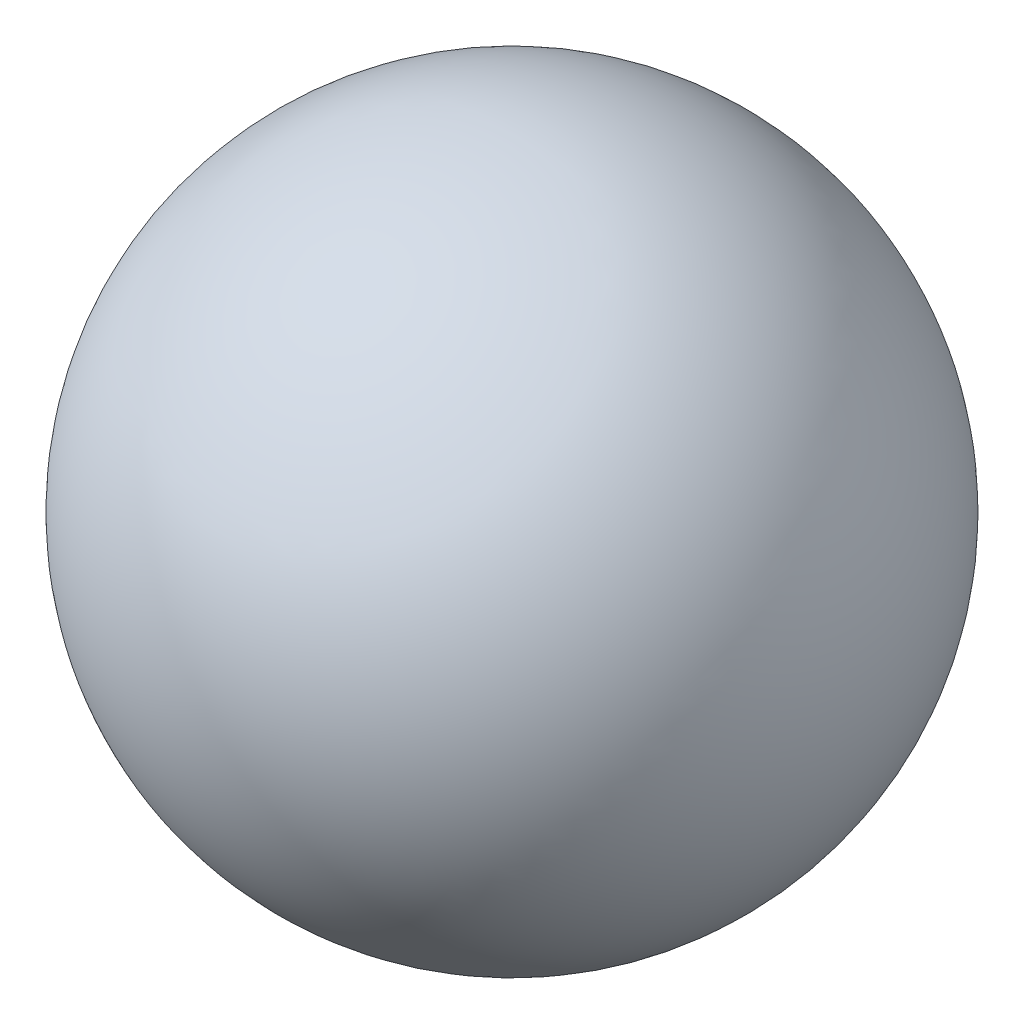
ISO-10303-21;
HEADER;
FILE_DESCRIPTION(('STEP AP214'),'2;1');
FILE_NAME('part.step','',(''),(''),'','','');
FILE_SCHEMA(('AUTOMOTIVE_DESIGN { 1 0 10303 214 1 1 1 1 }'));
ENDSEC;
DATA;
#1=APPLICATION_CONTEXT('core data for automotive mechanical design processes');
#2=APPLICATION_PROTOCOL_DEFINITION('international standard','automotive_design',2000,#1);
#3=PRODUCT_CONTEXT('',#1,'mechanical');
#4=PRODUCT('Part','Part','',(#3));
#5=PRODUCT_RELATED_PRODUCT_CATEGORY('part','',(#4));
#6=PRODUCT_DEFINITION_FORMATION('','',#4);
#7=PRODUCT_DEFINITION_CONTEXT('part definition',#1,'design');
#8=PRODUCT_DEFINITION('design','',#6,#7);
#9=PRODUCT_DEFINITION_SHAPE('','',#8);
#10=(LENGTH_UNIT() NAMED_UNIT(*) SI_UNIT(.MILLI.,.METRE.));
#11=(NAMED_UNIT(*) PLANE_ANGLE_UNIT() SI_UNIT($,.RADIAN.));
#12=(NAMED_UNIT(*) SI_UNIT($,.STERADIAN.) SOLID_ANGLE_UNIT());
#13=UNCERTAINTY_MEASURE_WITH_UNIT(LENGTH_MEASURE(1.E-05),#10,'distance_accuracy_value','');
#14=(GEOMETRIC_REPRESENTATION_CONTEXT(3) GLOBAL_UNCERTAINTY_ASSIGNED_CONTEXT((#13)) GLOBAL_UNIT_ASSIGNED_CONTEXT((#10,
#11,#12)) REPRESENTATION_CONTEXT('',''));
#15=CARTESIAN_POINT('',(0.,0.,0.));
#16=DIRECTION('',(0.,0.,1.));
#17=DIRECTION('',(1.,0.,0.));
#18=AXIS2_PLACEMENT_3D('',#15,#16,#17);
#19=CARTESIAN_POINT('',(0.,0.,-10.));
#20=DIRECTION('',(0.,0.,1.));
#21=DIRECTION('',(1.,0.,0.));
#22=AXIS2_PLACEMENT_3D('',#19,#20,#21);
#23=CYLINDRICAL_SURFACE('',#22,2.);
#24=CARTESIAN_POINT('',(0.,0.,0.));
#25=DIRECTION('',(0.,0.,1.));
#26=DIRECTION('',(1.,0.,0.));
#27=AXIS2_PLACEMENT_3D('',#24,#25,#26);
#28=CIRCLE('',#27,2.);
#29=CARTESIAN_POINT('',(2.,0.,0.));
#30=VERTEX_POINT('',#29);
#31=EDGE_CURVE('E10',#30,#30,#28,.T.);
#32=ORIENTED_EDGE('',*,*,#31,.T.);
#33=EDGE_LOOP('',(#32));
#34=FACE_BOUND('',#33,.T.);
#35=CARTESIAN_POINT('',(0.,0.,-4.2));
#36=DIRECTION('',(0.,0.,-1.));
#37=DIRECTION('',(-1.,0.,0.));
#38=AXIS2_PLACEMENT_3D('',#35,#36,#37);
#39=CIRCLE('',#38,2.);
#40=CARTESIAN_POINT('',(-2.,0.,-4.2));
#41=VERTEX_POINT('',#40);
#42=EDGE_CURVE('E36',#41,#41,#39,.F.);
#43=ORIENTED_EDGE('',*,*,#42,.F.);
#44=EDGE_LOOP('',(#43));
#45=FACE_BOUND('',#44,.T.);
#46=ADVANCED_FACE('F32',(#34,#45),#23,.F.);
#47=CARTESIAN_POINT('',(0.,0.,0.));
#48=DIRECTION('',(0.,0.,1.));
#49=DIRECTION('',(1.,0.,0.));
#50=AXIS2_PLACEMENT_3D('',#47,#48,#49);
#51=PLANE('',#50);
#52=ORIENTED_EDGE('',*,*,#31,.F.);
#53=EDGE_LOOP('',(#52));
#54=FACE_BOUND('',#53,.T.);
#55=ADVANCED_FACE('F53',(#54),#51,.F.);
#56=CARTESIAN_POINT('',(0.,0.,-4.2));
#57=DIRECTION('',(0.,0.,-1.));
#58=DIRECTION('',(-1.,0.,0.));
#59=AXIS2_PLACEMENT_3D('',#56,#57,#58);
#60=PLANE('',#59);
#61=ORIENTED_EDGE('',*,*,#42,.T.);
#62=EDGE_LOOP('',(#61));
#63=FACE_BOUND('',#62,.T.);
#64=CARTESIAN_POINT('',(0.,0.,-4.2));
#65=DIRECTION('',(0.,0.,-1.));
#66=DIRECTION('',(-1.,0.,0.));
#67=AXIS2_PLACEMENT_3D('',#64,#65,#66);
#68=CIRCLE('',#67,2.71293199325011);
#69=CARTESIAN_POINT('',(-2.71293199325011,0.,-4.2));
#70=VERTEX_POINT('',#69);
#71=EDGE_CURVE('E40',#70,#70,#68,.T.);
#72=ORIENTED_EDGE('',*,*,#71,.T.);
#73=EDGE_LOOP('',(#72));
#74=FACE_BOUND('',#73,.T.);
#75=ADVANCED_FACE('F50',(#63,#74),#60,.T.);
#76=CARTESIAN_POINT('',(0.,0.,0.));
#77=DIRECTION('',(-1.,0.,0.));
#78=DIRECTION('',(0.,1.,0.));
#79=AXIS2_PLACEMENT_3D('',#76,#77,#78);
#80=SPHERICAL_SURFACE('',#79,5.);
#81=CARTESIAN_POINT('',(0.,0.,0.));
#82=DIRECTION('',(0.,0.,-1.));
#83=DIRECTION('',(-1.,0.,0.));
#84=AXIS2_PLACEMENT_3D('',#81,#82,#83);
#85=SPHERICAL_SURFACE('',#84,5.);
#86=ORIENTED_EDGE('',*,*,#71,.F.);
#87=EDGE_LOOP('',(#86));
#88=FACE_BOUND('',#87,.T.);
#89=ADVANCED_FACE('F34',(#88),#85,.T.);
#90=CLOSED_SHELL('',(#46,#55,#75,#89));
#91=MANIFOLD_SOLID_BREP('B2',#90);
#92=ADVANCED_BREP_SHAPE_REPRESENTATION('',(#18,#91),#14);
#93=SHAPE_DEFINITION_REPRESENTATION(#9,#92);
ENDSEC;
END-ISO-10303-21;
